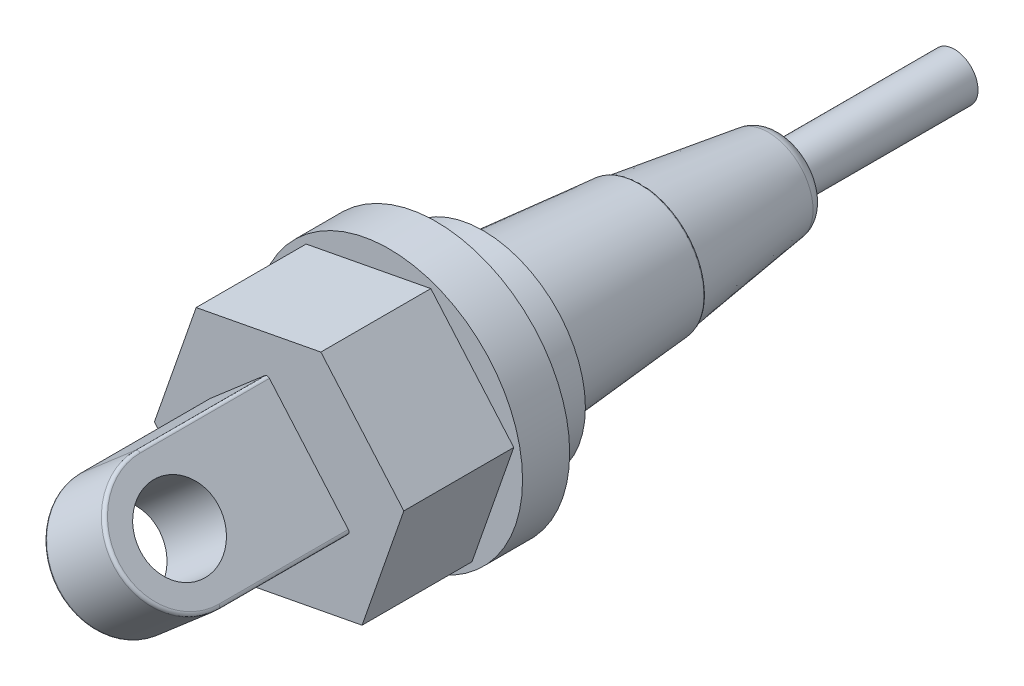
ISO-10303-21;
HEADER;
FILE_DESCRIPTION(('STEP AP214'),'2;1');
FILE_NAME('part.step','',(''),(''),'','','');
FILE_SCHEMA(('AUTOMOTIVE_DESIGN { 1 0 10303 214 1 1 1 1 }'));
ENDSEC;
DATA;
#1=APPLICATION_CONTEXT('core data for automotive mechanical design processes');
#2=APPLICATION_PROTOCOL_DEFINITION('international standard','automotive_design',2000,#1);
#3=PRODUCT_CONTEXT('',#1,'mechanical');
#4=PRODUCT('Part','Part','',(#3));
#5=PRODUCT_RELATED_PRODUCT_CATEGORY('part','',(#4));
#6=PRODUCT_DEFINITION_FORMATION('','',#4);
#7=PRODUCT_DEFINITION_CONTEXT('part definition',#1,'design');
#8=PRODUCT_DEFINITION('design','',#6,#7);
#9=PRODUCT_DEFINITION_SHAPE('','',#8);
#10=(LENGTH_UNIT() NAMED_UNIT(*) SI_UNIT(.MILLI.,.METRE.));
#11=(NAMED_UNIT(*) PLANE_ANGLE_UNIT() SI_UNIT($,.RADIAN.));
#12=(NAMED_UNIT(*) SI_UNIT($,.STERADIAN.) SOLID_ANGLE_UNIT());
#13=UNCERTAINTY_MEASURE_WITH_UNIT(LENGTH_MEASURE(1.E-05),#10,'distance_accuracy_value','');
#14=(GEOMETRIC_REPRESENTATION_CONTEXT(3) GLOBAL_UNCERTAINTY_ASSIGNED_CONTEXT((#13)) GLOBAL_UNIT_ASSIGNED_CONTEXT((#10,
#11,#12)) REPRESENTATION_CONTEXT('',''));
#15=CARTESIAN_POINT('',(0.,0.,0.));
#16=DIRECTION('',(0.,0.,1.));
#17=DIRECTION('',(1.,0.,0.));
#18=AXIS2_PLACEMENT_3D('',#15,#16,#17);
#19=CARTESIAN_POINT('',(0.,0.,10.));
#20=DIRECTION('',(0.,0.,1.));
#21=DIRECTION('',(1.,0.,0.));
#22=AXIS2_PLACEMENT_3D('',#19,#20,#21);
#23=PLANE('',#22);
#24=DIRECTION('',(0.982291780503088,0.187357567117191,0.));
#25=VECTOR('',#24,1.);
#26=CARTESIAN_POINT('',(-2.65838199745316,-1.35106512820731,10.));
#27=LINE('',#26,#25);
#28=CARTESIAN_POINT('',(-2.65838199745316,-1.35106512820731,10.));
#29=VERTEX_POINT('',#28);
#30=CARTESIAN_POINT('',(5.28138793709384,0.163328057130217,10.));
#31=VERTEX_POINT('',#30);
#32=EDGE_CURVE('E148',#29,#31,#27,.T.);
#33=ORIENTED_EDGE('',*,*,#32,.T.);
#34=DIRECTION('',(0.328889477536808,0.944368419402918,0.));
#35=VECTOR('',#34,1.);
#36=CARTESIAN_POINT('',(5.28138793709384,0.163328057130217,10.));
#37=LINE('',#36,#35);
#38=CARTESIAN_POINT('',(7.93976993454701,7.7965671133206,10.));
#39=VERTEX_POINT('',#38);
#40=EDGE_CURVE('E137',#31,#39,#37,.T.);
#41=ORIENTED_EDGE('',*,*,#40,.T.);
#42=DIRECTION('',(-0.65340230296628,0.757010852285727,0.));
#43=VECTOR('',#42,1.);
#44=CARTESIAN_POINT('',(7.93976993454701,7.7965671133206,10.));
#45=LINE('',#44,#43);
#46=CARTESIAN_POINT('',(2.65838199745316,13.9154129841735,10.));
#47=VERTEX_POINT('',#46);
#48=EDGE_CURVE('E147',#39,#47,#45,.T.);
#49=ORIENTED_EDGE('',*,*,#48,.T.);
#50=DIRECTION('',(-0.982291780503088,-0.187357567117191,0.));
#51=VECTOR('',#50,1.);
#52=CARTESIAN_POINT('',(2.65838199745316,13.9154129841735,10.));
#53=LINE('',#52,#51);
#54=CARTESIAN_POINT('',(-5.28138793709384,12.4010197988359,10.));
#55=VERTEX_POINT('',#54);
#56=EDGE_CURVE('E266',#47,#55,#53,.T.);
#57=ORIENTED_EDGE('',*,*,#56,.T.);
#58=DIRECTION('',(-0.328889477536808,-0.944368419402918,0.));
#59=VECTOR('',#58,1.);
#60=CARTESIAN_POINT('',(-5.28138793709384,12.4010197988359,10.));
#61=LINE('',#60,#59);
#62=CARTESIAN_POINT('',(-7.93976993454701,4.76778074264554,10.));
#63=VERTEX_POINT('',#62);
#64=EDGE_CURVE('E268',#55,#63,#61,.T.);
#65=ORIENTED_EDGE('',*,*,#64,.T.);
#66=DIRECTION('',(0.65340230296628,-0.757010852285727,0.));
#67=VECTOR('',#66,1.);
#68=CARTESIAN_POINT('',(-7.93976993454701,4.76778074264554,10.));
#69=LINE('',#68,#67);
#70=EDGE_CURVE('E153',#63,#29,#69,.T.);
#71=ORIENTED_EDGE('',*,*,#70,.T.);
#72=EDGE_LOOP('',(#33,#41,#49,#57,#65,#71));
#73=FACE_BOUND('',#72,.T.);
#74=DIRECTION('',(0.757010852285727,0.653402302966279,0.));
#75=VECTOR('',#74,1.);
#76=CARTESIAN_POINT('',(-4.53322109926123,7.70809110599379,10.));
#77=LINE('',#76,#75);
#78=CARTESIAN_POINT('',(-4.38181892880409,7.83877156658705,10.));
#79=VERTEX_POINT('',#78);
#80=CARTESIAN_POINT('',(-0.899569008289742,10.8444221602319,10.));
#81=VERTEX_POINT('',#80);
#82=EDGE_CURVE('E242',#79,#81,#77,.T.);
#83=ORIENTED_EDGE('',*,*,#82,.T.);
#84=CARTESIAN_POINT('',(-0.768888547696487,10.6930199897748,10.));
#85=DIRECTION('',(0.,0.,1.));
#86=DIRECTION('',(1.,0.,0.));
#87=AXIS2_PLACEMENT_3D('',#84,#85,#86);
#88=CIRCLE('',#87,0.2);
#89=CARTESIAN_POINT('',(-0.617486377239341,10.823700450368,10.));
#90=VERTEX_POINT('',#89);
#91=EDGE_CURVE('E215',#81,#90,#88,.F.);
#92=ORIENTED_EDGE('',*,*,#91,.T.);
#93=DIRECTION('',(0.653402302966279,-0.757010852285727,0.));
#94=VECTOR('',#93,1.);
#95=CARTESIAN_POINT('',(-0.748166837832597,10.9751026208252,10.));
#96=LINE('',#95,#94);
#97=CARTESIAN_POINT('',(4.40254063866798,5.00765892042949,10.));
#98=VERTEX_POINT('',#97);
#99=EDGE_CURVE('E236',#90,#98,#96,.T.);
#100=ORIENTED_EDGE('',*,*,#99,.T.);
#101=CARTESIAN_POINT('',(4.25113846821084,4.87697845983623,10.));
#102=DIRECTION('',(0.,0.,1.));
#103=DIRECTION('',(1.,0.,0.));
#104=AXIS2_PLACEMENT_3D('',#101,#102,#103);
#105=CIRCLE('',#104,0.2);
#106=CARTESIAN_POINT('',(4.38181892880409,4.72557628937908,10.));
#107=VERTEX_POINT('',#106);
#108=EDGE_CURVE('E213',#98,#107,#105,.F.);
#109=ORIENTED_EDGE('',*,*,#108,.T.);
#110=DIRECTION('',(0.757010852285727,0.653402302966279,0.));
#111=VECTOR('',#110,1.);
#112=CARTESIAN_POINT('',(0.748166837832606,1.58924523514094,10.));
#113=LINE('',#112,#111);
#114=CARTESIAN_POINT('',(0.899569008289751,1.7199256957342,10.));
#115=VERTEX_POINT('',#114);
#116=EDGE_CURVE('E253',#115,#107,#113,.T.);
#117=ORIENTED_EDGE('',*,*,#116,.F.);
#118=CARTESIAN_POINT('',(0.768888547696495,1.87132786619134,10.));
#119=DIRECTION('',(0.,0.,1.));
#120=DIRECTION('',(1.,0.,0.));
#121=AXIS2_PLACEMENT_3D('',#118,#119,#120);
#122=CIRCLE('',#121,0.2);
#123=CARTESIAN_POINT('',(0.617486377239347,1.74064740559809,10.));
#124=VERTEX_POINT('',#123);
#125=EDGE_CURVE('E43',#115,#124,#122,.F.);
#126=ORIENTED_EDGE('',*,*,#125,.T.);
#127=DIRECTION('',(0.653402302966279,-0.757010852285727,0.));
#128=VECTOR('',#127,1.);
#129=CARTESIAN_POINT('',(-4.53322109926123,7.70809110599379,10.));
#130=LINE('',#129,#128);
#131=CARTESIAN_POINT('',(-4.40254063866798,7.55668893553665,10.));
#132=VERTEX_POINT('',#131);
#133=EDGE_CURVE('E239',#132,#124,#130,.T.);
#134=ORIENTED_EDGE('',*,*,#133,.F.);
#135=CARTESIAN_POINT('',(-4.25113846821083,7.6873693961299,10.));
#136=DIRECTION('',(0.,0.,1.));
#137=DIRECTION('',(1.,0.,0.));
#138=AXIS2_PLACEMENT_3D('',#135,#136,#137);
#139=CIRCLE('',#138,0.2);
#140=EDGE_CURVE('E11',#132,#79,#139,.F.);
#141=ORIENTED_EDGE('',*,*,#140,.T.);
#142=EDGE_LOOP('',(#83,#92,#100,#109,#117,#126,#134,#141));
#143=FACE_BOUND('',#142,.T.);
#144=ADVANCED_FACE('F34',(#73,#143),#23,.T.);
#145=CARTESIAN_POINT('',(0.,6.28217392798307,3.));
#146=DIRECTION('',(0.,0.,1.));
#147=DIRECTION('',(1.,0.,0.));
#148=AXIS2_PLACEMENT_3D('',#145,#146,#147);
#149=PLANE('',#148);
#150=CARTESIAN_POINT('',(0.,6.28217392798307,3.));
#151=DIRECTION('',(0.,0.,1.));
#152=DIRECTION('',(1.,0.,0.));
#153=AXIS2_PLACEMENT_3D('',#150,#151,#152);
#154=CIRCLE('',#153,8.5);
#155=CARTESIAN_POINT('',(8.5,6.28217392798307,3.));
#156=VERTEX_POINT('',#155);
#157=EDGE_CURVE('E166',#156,#156,#154,.T.);
#158=ORIENTED_EDGE('',*,*,#157,.T.);
#159=EDGE_LOOP('',(#158));
#160=FACE_BOUND('',#159,.T.);
#161=DIRECTION('',(0.328889477536808,0.944368419402918,0.));
#162=VECTOR('',#161,1.);
#163=CARTESIAN_POINT('',(5.28138793709384,0.163328057130217,3.));
#164=LINE('',#163,#162);
#165=CARTESIAN_POINT('',(5.28138793709384,0.163328057130217,3.));
#166=VERTEX_POINT('',#165);
#167=CARTESIAN_POINT('',(7.93976993454701,7.7965671133206,3.));
#168=VERTEX_POINT('',#167);
#169=EDGE_CURVE('E273',#166,#168,#164,.T.);
#170=ORIENTED_EDGE('',*,*,#169,.F.);
#171=DIRECTION('',(0.982291780503088,0.187357567117191,0.));
#172=VECTOR('',#171,1.);
#173=CARTESIAN_POINT('',(-2.65838199745316,-1.35106512820731,3.));
#174=LINE('',#173,#172);
#175=CARTESIAN_POINT('',(-2.65838199745316,-1.35106512820731,3.));
#176=VERTEX_POINT('',#175);
#177=EDGE_CURVE('E161',#176,#166,#174,.T.);
#178=ORIENTED_EDGE('',*,*,#177,.F.);
#179=DIRECTION('',(0.65340230296628,-0.757010852285727,0.));
#180=VECTOR('',#179,1.);
#181=CARTESIAN_POINT('',(-7.93976993454701,4.76778074264554,3.));
#182=LINE('',#181,#180);
#183=CARTESIAN_POINT('',(-7.93976993454701,4.76778074264554,3.));
#184=VERTEX_POINT('',#183);
#185=EDGE_CURVE('E157',#184,#176,#182,.T.);
#186=ORIENTED_EDGE('',*,*,#185,.F.);
#187=DIRECTION('',(-0.328889477536808,-0.944368419402918,0.));
#188=VECTOR('',#187,1.);
#189=CARTESIAN_POINT('',(-5.28138793709384,12.4010197988359,3.));
#190=LINE('',#189,#188);
#191=CARTESIAN_POINT('',(-5.28138793709384,12.4010197988359,3.));
#192=VERTEX_POINT('',#191);
#193=EDGE_CURVE('E279',#192,#184,#190,.T.);
#194=ORIENTED_EDGE('',*,*,#193,.F.);
#195=DIRECTION('',(-0.982291780503088,-0.187357567117191,0.));
#196=VECTOR('',#195,1.);
#197=CARTESIAN_POINT('',(2.65838199745316,13.9154129841735,3.));
#198=LINE('',#197,#196);
#199=CARTESIAN_POINT('',(2.65838199745316,13.9154129841735,3.));
#200=VERTEX_POINT('',#199);
#201=EDGE_CURVE('E277',#200,#192,#198,.T.);
#202=ORIENTED_EDGE('',*,*,#201,.F.);
#203=DIRECTION('',(-0.65340230296628,0.757010852285727,0.));
#204=VECTOR('',#203,1.);
#205=CARTESIAN_POINT('',(7.93976993454701,7.7965671133206,3.));
#206=LINE('',#205,#204);
#207=EDGE_CURVE('E275',#168,#200,#206,.T.);
#208=ORIENTED_EDGE('',*,*,#207,.F.);
#209=EDGE_LOOP('',(#170,#178,#186,#194,#202,#208));
#210=FACE_BOUND('',#209,.T.);
#211=ADVANCED_FACE('F299',(#160,#210),#149,.T.);
#212=CARTESIAN_POINT('',(0.,6.28217392798307,3.));
#213=DIRECTION('',(0.,0.,-1.));
#214=DIRECTION('',(-1.,0.,0.));
#215=AXIS2_PLACEMENT_3D('',#212,#213,#214);
#216=CYLINDRICAL_SURFACE('',#215,8.5);
#217=ORIENTED_EDGE('',*,*,#157,.F.);
#218=EDGE_LOOP('',(#217));
#219=FACE_BOUND('',#218,.T.);
#220=CARTESIAN_POINT('',(0.,6.28217392798307,0.));
#221=DIRECTION('',(0.,0.,1.));
#222=DIRECTION('',(1.,0.,0.));
#223=AXIS2_PLACEMENT_3D('',#220,#221,#222);
#224=CIRCLE('',#223,8.5);
#225=CARTESIAN_POINT('',(8.5,6.28217392798307,0.));
#226=VERTEX_POINT('',#225);
#227=EDGE_CURVE('E163',#226,#226,#224,.T.);
#228=ORIENTED_EDGE('',*,*,#227,.T.);
#229=EDGE_LOOP('',(#228));
#230=FACE_BOUND('',#229,.T.);
#231=ADVANCED_FACE('F319',(#219,#230),#216,.T.);
#232=CARTESIAN_POINT('',(0.,6.28217392798307,0.));
#233=DIRECTION('',(0.,0.,1.));
#234=DIRECTION('',(1.,0.,0.));
#235=AXIS2_PLACEMENT_3D('',#232,#233,#234);
#236=PLANE('',#235);
#237=CARTESIAN_POINT('',(0.,6.28217392798307,0.));
#238=DIRECTION('',(0.,0.,1.));
#239=DIRECTION('',(1.,0.,0.));
#240=AXIS2_PLACEMENT_3D('',#237,#238,#239);
#241=CIRCLE('',#240,6.5);
#242=CARTESIAN_POINT('',(6.5,6.28217392798307,0.));
#243=VERTEX_POINT('',#242);
#244=EDGE_CURVE('E173',#243,#243,#241,.F.);
#245=ORIENTED_EDGE('',*,*,#244,.F.);
#246=EDGE_LOOP('',(#245));
#247=FACE_BOUND('',#246,.T.);
#248=ORIENTED_EDGE('',*,*,#227,.F.);
#249=EDGE_LOOP('',(#248));
#250=FACE_BOUND('',#249,.T.);
#251=ADVANCED_FACE('F580',(#247,#250),#236,.F.);
#252=CARTESIAN_POINT('',(-2.65838199745316,-1.35106512820731,10.));
#253=DIRECTION('',(-0.187357567117191,0.982291780503088,0.));
#254=DIRECTION('',(-0.982291780503088,-0.187357567117191,0.));
#255=AXIS2_PLACEMENT_3D('',#252,#253,#254);
#256=PLANE('',#255);
#257=ORIENTED_EDGE('',*,*,#177,.T.);
#258=DIRECTION('',(0.,0.,-1.));
#259=VECTOR('',#258,1.);
#260=CARTESIAN_POINT('',(5.28138793709384,0.163328057130217,10.));
#261=LINE('',#260,#259);
#262=EDGE_CURVE('E141',#31,#166,#261,.T.);
#263=ORIENTED_EDGE('',*,*,#262,.F.);
#264=ORIENTED_EDGE('',*,*,#32,.F.);
#265=DIRECTION('',(0.,0.,-1.));
#266=VECTOR('',#265,1.);
#267=CARTESIAN_POINT('',(-2.65838199745316,-1.35106512820731,10.));
#268=LINE('',#267,#266);
#269=EDGE_CURVE('E271',#29,#176,#268,.T.);
#270=ORIENTED_EDGE('',*,*,#269,.T.);
#271=EDGE_LOOP('',(#257,#263,#264,#270));
#272=FACE_BOUND('',#271,.T.);
#273=ADVANCED_FACE('F159',(#272),#256,.F.);
#274=CARTESIAN_POINT('',(5.28138793709384,0.163328057130217,10.));
#275=DIRECTION('',(-0.944368419402918,0.328889477536808,0.));
#276=DIRECTION('',(-0.328889477536808,-0.944368419402918,0.));
#277=AXIS2_PLACEMENT_3D('',#274,#275,#276);
#278=PLANE('',#277);
#279=ORIENTED_EDGE('',*,*,#169,.T.);
#280=DIRECTION('',(0.,0.,-1.));
#281=VECTOR('',#280,1.);
#282=CARTESIAN_POINT('',(7.93976993454701,7.7965671133206,10.));
#283=LINE('',#282,#281);
#284=EDGE_CURVE('E144',#39,#168,#283,.T.);
#285=ORIENTED_EDGE('',*,*,#284,.F.);
#286=ORIENTED_EDGE('',*,*,#40,.F.);
#287=ORIENTED_EDGE('',*,*,#262,.T.);
#288=EDGE_LOOP('',(#279,#285,#286,#287));
#289=FACE_BOUND('',#288,.T.);
#290=ADVANCED_FACE('F139',(#289),#278,.F.);
#291=CARTESIAN_POINT('',(7.93976993454701,7.7965671133206,10.));
#292=DIRECTION('',(-0.757010852285727,-0.65340230296628,0.));
#293=DIRECTION('',(0.65340230296628,-0.757010852285727,0.));
#294=AXIS2_PLACEMENT_3D('',#291,#292,#293);
#295=PLANE('',#294);
#296=ORIENTED_EDGE('',*,*,#207,.T.);
#297=DIRECTION('',(0.,0.,-1.));
#298=VECTOR('',#297,1.);
#299=CARTESIAN_POINT('',(2.65838199745316,13.9154129841735,10.));
#300=LINE('',#299,#298);
#301=EDGE_CURVE('E168',#47,#200,#300,.T.);
#302=ORIENTED_EDGE('',*,*,#301,.F.);
#303=ORIENTED_EDGE('',*,*,#48,.F.);
#304=ORIENTED_EDGE('',*,*,#284,.T.);
#305=EDGE_LOOP('',(#296,#302,#303,#304));
#306=FACE_BOUND('',#305,.T.);
#307=ADVANCED_FACE('F305',(#306),#295,.F.);
#308=CARTESIAN_POINT('',(2.65838199745316,13.9154129841735,10.));
#309=DIRECTION('',(0.187357567117191,-0.982291780503088,0.));
#310=DIRECTION('',(0.982291780503088,0.187357567117191,0.));
#311=AXIS2_PLACEMENT_3D('',#308,#309,#310);
#312=PLANE('',#311);
#313=ORIENTED_EDGE('',*,*,#201,.T.);
#314=DIRECTION('',(0.,0.,-1.));
#315=VECTOR('',#314,1.);
#316=CARTESIAN_POINT('',(-5.28138793709384,12.4010197988359,10.));
#317=LINE('',#316,#315);
#318=EDGE_CURVE('E286',#55,#192,#317,.T.);
#319=ORIENTED_EDGE('',*,*,#318,.F.);
#320=ORIENTED_EDGE('',*,*,#56,.F.);
#321=ORIENTED_EDGE('',*,*,#301,.T.);
#322=EDGE_LOOP('',(#313,#319,#320,#321));
#323=FACE_BOUND('',#322,.T.);
#324=ADVANCED_FACE('F293',(#323),#312,.F.);
#325=CARTESIAN_POINT('',(-5.28138793709384,12.4010197988359,10.));
#326=DIRECTION('',(0.944368419402918,-0.328889477536808,0.));
#327=DIRECTION('',(0.328889477536808,0.944368419402918,0.));
#328=AXIS2_PLACEMENT_3D('',#325,#326,#327);
#329=PLANE('',#328);
#330=ORIENTED_EDGE('',*,*,#193,.T.);
#331=DIRECTION('',(0.,0.,-1.));
#332=VECTOR('',#331,1.);
#333=CARTESIAN_POINT('',(-7.93976993454701,4.76778074264554,10.));
#334=LINE('',#333,#332);
#335=EDGE_CURVE('E284',#63,#184,#334,.T.);
#336=ORIENTED_EDGE('',*,*,#335,.F.);
#337=ORIENTED_EDGE('',*,*,#64,.F.);
#338=ORIENTED_EDGE('',*,*,#318,.T.);
#339=EDGE_LOOP('',(#330,#336,#337,#338));
#340=FACE_BOUND('',#339,.T.);
#341=ADVANCED_FACE('F303',(#340),#329,.F.);
#342=CARTESIAN_POINT('',(-7.93976993454701,4.76778074264554,10.));
#343=DIRECTION('',(0.757010852285726,0.65340230296628,0.));
#344=DIRECTION('',(-0.65340230296628,0.757010852285727,0.));
#345=AXIS2_PLACEMENT_3D('',#342,#343,#344);
#346=PLANE('',#345);
#347=ORIENTED_EDGE('',*,*,#185,.T.);
#348=ORIENTED_EDGE('',*,*,#269,.F.);
#349=ORIENTED_EDGE('',*,*,#70,.F.);
#350=ORIENTED_EDGE('',*,*,#335,.T.);
#351=EDGE_LOOP('',(#347,#348,#349,#350));
#352=FACE_BOUND('',#351,.T.);
#353=ADVANCED_FACE('F326',(#352),#346,.F.);
#354=CARTESIAN_POINT('',(0.,6.28217392798307,-3.));
#355=DIRECTION('',(0.,0.,1.));
#356=DIRECTION('',(1.,0.,0.));
#357=AXIS2_PLACEMENT_3D('',#354,#355,#356);
#358=CYLINDRICAL_SURFACE('',#357,6.5);
#359=CARTESIAN_POINT('',(0.,6.28217392798307,-3.));
#360=DIRECTION('',(0.,0.,-1.));
#361=DIRECTION('',(-1.,0.,0.));
#362=AXIS2_PLACEMENT_3D('',#359,#360,#361);
#363=CIRCLE('',#362,6.5);
#364=CARTESIAN_POINT('',(-6.5,6.28217392798307,-3.));
#365=VERTEX_POINT('',#364);
#366=EDGE_CURVE('E262',#365,#365,#363,.T.);
#367=ORIENTED_EDGE('',*,*,#366,.F.);
#368=EDGE_LOOP('',(#367));
#369=FACE_BOUND('',#368,.T.);
#370=ORIENTED_EDGE('',*,*,#244,.T.);
#371=EDGE_LOOP('',(#370));
#372=FACE_BOUND('',#371,.T.);
#373=ADVANCED_FACE('F324',(#369,#372),#358,.T.);
#374=CARTESIAN_POINT('',(0.,6.28217392798307,-3.));
#375=DIRECTION('',(0.,0.,-1.));
#376=DIRECTION('',(-1.,0.,0.));
#377=AXIS2_PLACEMENT_3D('',#374,#375,#376);
#378=PLANE('',#377);
#379=CARTESIAN_POINT('',(0.,6.28217392798307,-3.));
#380=DIRECTION('',(0.,0.,-1.));
#381=DIRECTION('',(-1.,0.,0.));
#382=AXIS2_PLACEMENT_3D('',#379,#380,#381);
#383=CIRCLE('',#382,5.);
#384=CARTESIAN_POINT('',(-5.,6.28217392798307,-3.));
#385=VERTEX_POINT('',#384);
#386=EDGE_CURVE('E259',#385,#385,#383,.T.);
#387=ORIENTED_EDGE('',*,*,#386,.F.);
#388=EDGE_LOOP('',(#387));
#389=FACE_BOUND('',#388,.T.);
#390=ORIENTED_EDGE('',*,*,#366,.T.);
#391=EDGE_LOOP('',(#390));
#392=FACE_BOUND('',#391,.T.);
#393=ADVANCED_FACE('F346',(#389,#392),#378,.T.);
#394=CARTESIAN_POINT('',(0.,6.28217392798307,-3.));
#395=DIRECTION('',(0.,0.,1.));
#396=DIRECTION('',(-1.,0.,0.));
#397=AXIS2_PLACEMENT_3D('',#394,#395,#396);
#398=CONICAL_SURFACE('',#397,5.,0.0872664625997165);
#399=CARTESIAN_POINT('',(0.,6.28217392798307,-12.9087155742748));
#400=DIRECTION('',(0.,0.,1.));
#401=DIRECTION('',(1.,0.,0.));
#402=AXIS2_PLACEMENT_3D('',#399,#400,#401);
#403=CIRCLE('',#402,4.13309971714819);
#404=CARTESIAN_POINT('',(4.13309971714819,6.28217392798307,-12.9087155742748));
#405=VERTEX_POINT('',#404);
#406=EDGE_CURVE('E180',#405,#405,#403,.T.);
#407=ORIENTED_EDGE('',*,*,#406,.T.);
#408=EDGE_LOOP('',(#407));
#409=FACE_BOUND('',#408,.T.);
#410=ORIENTED_EDGE('',*,*,#386,.T.);
#411=EDGE_LOOP('',(#410));
#412=FACE_BOUND('',#411,.T.);
#413=ADVANCED_FACE('F353',(#409,#412),#398,.T.);
#414=CARTESIAN_POINT('',(0.,6.28217392798307,-13.));
#415=DIRECTION('',(0.,0.,-1.));
#416=DIRECTION('',(-1.,0.,0.));
#417=AXIS2_PLACEMENT_3D('',#414,#415,#416);
#418=PLANE('',#417);
#419=CARTESIAN_POINT('',(0.,6.28217392798307,-13.));
#420=DIRECTION('',(0.,0.,-1.));
#421=DIRECTION('',(-1.,0.,0.));
#422=AXIS2_PLACEMENT_3D('',#419,#420,#421);
#423=CIRCLE('',#422,4.03348024733902);
#424=CARTESIAN_POINT('',(-4.03348024733902,6.28217392798307,-13.));
#425=VERTEX_POINT('',#424);
#426=EDGE_CURVE('E177',#425,#425,#423,.T.);
#427=ORIENTED_EDGE('',*,*,#426,.T.);
#428=EDGE_LOOP('',(#427));
#429=FACE_BOUND('',#428,.T.);
#430=CARTESIAN_POINT('',(0.,6.28217392798307,-13.));
#431=DIRECTION('',(0.,0.,-1.));
#432=DIRECTION('',(-1.,0.,0.));
#433=AXIS2_PLACEMENT_3D('',#430,#431,#432);
#434=CIRCLE('',#433,4.);
#435=CARTESIAN_POINT('',(-4.,6.28217392798307,-13.));
#436=VERTEX_POINT('',#435);
#437=EDGE_CURVE('E256',#436,#436,#434,.T.);
#438=ORIENTED_EDGE('',*,*,#437,.F.);
#439=EDGE_LOOP('',(#438));
#440=FACE_BOUND('',#439,.T.);
#441=ADVANCED_FACE('F360',(#429,#440),#418,.T.);
#442=CARTESIAN_POINT('',(0.,6.28217392798307,-13.));
#443=DIRECTION('',(0.,0.,1.));
#444=DIRECTION('',(-1.,0.,0.));
#445=AXIS2_PLACEMENT_3D('',#442,#443,#444);
#446=CONICAL_SURFACE('',#445,4.,0.139626340159546);
#447=CARTESIAN_POINT('',(0.,6.28217392798307,-21.1391731009601));
#448=DIRECTION('',(0.,0.,1.));
#449=DIRECTION('',(1.,0.,0.));
#450=AXIS2_PLACEMENT_3D('',#447,#448,#449);
#451=CIRCLE('',#450,2.85611381860382);
#452=CARTESIAN_POINT('',(2.85611381860382,6.28217392798307,-21.1391731009601));
#453=VERTEX_POINT('',#452);
#454=EDGE_CURVE('E186',#453,#453,#451,.T.);
#455=ORIENTED_EDGE('',*,*,#454,.T.);
#456=EDGE_LOOP('',(#455));
#457=FACE_BOUND('',#456,.T.);
#458=ORIENTED_EDGE('',*,*,#437,.T.);
#459=EDGE_LOOP('',(#458));
#460=FACE_BOUND('',#459,.T.);
#461=ADVANCED_FACE('F368',(#457,#460),#446,.T.);
#462=CARTESIAN_POINT('',(0.,6.28217392798307,-22.));
#463=DIRECTION('',(0.,0.,-1.));
#464=DIRECTION('',(-1.,0.,0.));
#465=AXIS2_PLACEMENT_3D('',#462,#463,#464);
#466=PLANE('',#465);
#467=CARTESIAN_POINT('',(0.,6.28217392798307,-22.));
#468=DIRECTION('',(0.,0.,-1.));
#469=DIRECTION('',(-1.,0.,0.));
#470=AXIS2_PLACEMENT_3D('',#467,#468,#469);
#471=CIRCLE('',#470,1.5);
#472=CARTESIAN_POINT('',(-1.5,6.28217392798307,-22.));
#473=VERTEX_POINT('',#472);
#474=EDGE_CURVE('E226',#473,#473,#471,.T.);
#475=ORIENTED_EDGE('',*,*,#474,.F.);
#476=EDGE_LOOP('',(#475));
#477=FACE_BOUND('',#476,.T.);
#478=CARTESIAN_POINT('',(0.,6.28217392798307,-22.));
#479=DIRECTION('',(0.,0.,-1.));
#480=DIRECTION('',(-1.,0.,0.));
#481=AXIS2_PLACEMENT_3D('',#478,#479,#480);
#482=CIRCLE('',#481,1.86584574986225);
#483=CARTESIAN_POINT('',(-1.86584574986225,6.28217392798307,-22.));
#484=VERTEX_POINT('',#483);
#485=EDGE_CURVE('E183',#484,#484,#482,.T.);
#486=ORIENTED_EDGE('',*,*,#485,.T.);
#487=EDGE_LOOP('',(#486));
#488=FACE_BOUND('',#487,.T.);
#489=ADVANCED_FACE('F377',(#477,#488),#466,.T.);
#490=CARTESIAN_POINT('',(0.,6.28217392798307,-12.9));
#491=DIRECTION('',(0.,0.,-1.));
#492=DIRECTION('',(-1.,0.,0.));
#493=AXIS2_PLACEMENT_3D('',#490,#491,#492);
#494=TOROIDAL_SURFACE('',#493,4.03348024733902,0.1);
#495=ORIENTED_EDGE('',*,*,#406,.F.);
#496=EDGE_LOOP('',(#495));
#497=FACE_BOUND('',#496,.T.);
#498=ORIENTED_EDGE('',*,*,#426,.F.);
#499=EDGE_LOOP('',(#498));
#500=FACE_BOUND('',#499,.T.);
#501=ADVANCED_FACE('F386',(#497,#500),#494,.T.);
#502=CARTESIAN_POINT('',(0.,6.28217392798307,-21.));
#503=DIRECTION('',(0.,0.,-1.));
#504=DIRECTION('',(-1.,0.,0.));
#505=AXIS2_PLACEMENT_3D('',#502,#503,#504);
#506=TOROIDAL_SURFACE('',#505,1.86584574986225,1.);
#507=ORIENTED_EDGE('',*,*,#454,.F.);
#508=EDGE_LOOP('',(#507));
#509=FACE_BOUND('',#508,.T.);
#510=ORIENTED_EDGE('',*,*,#485,.F.);
#511=EDGE_LOOP('',(#510));
#512=FACE_BOUND('',#511,.T.);
#513=ADVANCED_FACE('F395',(#509,#512),#506,.T.);
#514=CARTESIAN_POINT('',(-1.89252713071431,4.64866817056737,18.231507410073));
#515=DIRECTION('',(0.757010852285727,0.653402302966279,0.));
#516=DIRECTION('',(-0.653402302966279,0.757010852285727,0.));
#517=AXIS2_PLACEMENT_3D('',#514,#515,#516);
#518=PLANE('',#517);
#519=ORIENTED_EDGE('',*,*,#133,.T.);
#520=DIRECTION('',(0.,0.,1.));
#521=VECTOR('',#520,1.);
#522=CARTESIAN_POINT('',(0.617486377239348,1.74064740559809,18.231507410073));
#523=LINE('',#522,#521);
#524=CARTESIAN_POINT('',(0.617486377239348,1.74064740559809,18.231507410073));
#525=VERTEX_POINT('',#524);
#526=EDGE_CURVE('E207',#124,#525,#523,.T.);
#527=ORIENTED_EDGE('',*,*,#526,.T.);
#528=CARTESIAN_POINT('',(-1.89252713071431,4.64866817056737,18.231507410073));
#529=DIRECTION('',(0.757010852285727,0.653402302966279,0.));
#530=DIRECTION('',(-0.653402302966279,0.757010852285727,0.));
#531=AXIS2_PLACEMENT_3D('',#528,#529,#530);
#532=CIRCLE('',#531,3.84145188432738);
#533=CARTESIAN_POINT('',(-4.40254063866798,7.55668893553665,18.231507410073));
#534=VERTEX_POINT('',#533);
#535=EDGE_CURVE('E51',#525,#534,#532,.F.);
#536=ORIENTED_EDGE('',*,*,#535,.T.);
#537=DIRECTION('',(0.,0.,-1.));
#538=VECTOR('',#537,1.);
#539=CARTESIAN_POINT('',(-4.40254063866798,7.55668893553665,18.231507410073));
#540=LINE('',#539,#538);
#541=EDGE_CURVE('E205',#534,#132,#540,.T.);
#542=ORIENTED_EDGE('',*,*,#541,.T.);
#543=EDGE_LOOP('',(#519,#527,#536,#542));
#544=FACE_BOUND('',#543,.T.);
#545=CARTESIAN_POINT('',(-1.89252713071431,4.64866817056737,18.231507410073));
#546=DIRECTION('',(-0.757010852285727,-0.653402302966279,0.));
#547=DIRECTION('',(0.653402302966279,-0.757010852285727,0.));
#548=AXIS2_PLACEMENT_3D('',#545,#546,#547);
#549=CIRCLE('',#548,2.5);
#550=CARTESIAN_POINT('',(-0.259021373298616,2.75614103985305,18.231507410073));
#551=VERTEX_POINT('',#550);
#552=EDGE_CURVE('E233',#551,#551,#549,.T.);
#553=ORIENTED_EDGE('',*,*,#552,.F.);
#554=EDGE_LOOP('',(#553));
#555=FACE_BOUND('',#554,.T.);
#556=ADVANCED_FACE('F402',(#544,#555),#518,.F.);
#557=CARTESIAN_POINT('',(1.89252713071432,7.91567968539876,18.231507410073));
#558=DIRECTION('',(0.757010852285727,0.653402302966279,0.));
#559=DIRECTION('',(-0.653402302966279,0.757010852285727,0.));
#560=AXIS2_PLACEMENT_3D('',#557,#558,#559);
#561=PLANE('',#560);
#562=CARTESIAN_POINT('',(1.89252713071432,7.91567968539876,18.231507410073));
#563=DIRECTION('',(0.757010852285727,0.653402302966279,0.));
#564=DIRECTION('',(-0.653402302966279,0.757010852285727,0.));
#565=AXIS2_PLACEMENT_3D('',#562,#563,#564);
#566=CIRCLE('',#565,3.84145188432738);
#567=CARTESIAN_POINT('',(-0.617486377239341,10.823700450368,18.231507410073));
#568=VERTEX_POINT('',#567);
#569=CARTESIAN_POINT('',(4.40254063866798,5.00765892042948,18.231507410073));
#570=VERTEX_POINT('',#569);
#571=EDGE_CURVE('E194',#568,#570,#566,.T.);
#572=ORIENTED_EDGE('',*,*,#571,.T.);
#573=DIRECTION('',(0.,0.,1.));
#574=VECTOR('',#573,1.);
#575=CARTESIAN_POINT('',(4.40254063866798,5.00765892042948,10.));
#576=LINE('',#575,#574);
#577=EDGE_CURVE('E198',#570,#98,#576,.F.);
#578=ORIENTED_EDGE('',*,*,#577,.T.);
#579=ORIENTED_EDGE('',*,*,#99,.F.);
#580=DIRECTION('',(0.,0.,-1.));
#581=VECTOR('',#580,1.);
#582=CARTESIAN_POINT('',(-0.617486377239343,10.823700450368,18.231507410073));
#583=LINE('',#582,#581);
#584=EDGE_CURVE('E196',#90,#568,#583,.F.);
#585=ORIENTED_EDGE('',*,*,#584,.T.);
#586=EDGE_LOOP('',(#572,#578,#579,#585));
#587=FACE_BOUND('',#586,.T.);
#588=CARTESIAN_POINT('',(1.89252713071432,7.91567968539876,18.231507410073));
#589=DIRECTION('',(-0.757010852285727,-0.653402302966279,0.));
#590=DIRECTION('',(0.653402302966279,-0.757010852285727,0.));
#591=AXIS2_PLACEMENT_3D('',#588,#589,#590);
#592=CIRCLE('',#591,2.5);
#593=CARTESIAN_POINT('',(3.52603288813002,6.02315255468445,18.231507410073));
#594=VERTEX_POINT('',#593);
#595=EDGE_CURVE('E222',#594,#594,#592,.T.);
#596=ORIENTED_EDGE('',*,*,#595,.T.);
#597=EDGE_LOOP('',(#596));
#598=FACE_BOUND('',#597,.T.);
#599=ADVANCED_FACE('F411',(#587,#598),#561,.T.);
#600=CARTESIAN_POINT('',(0.748166837832604,1.58924523514094,18.231507410073));
#601=DIRECTION('',(-0.653402302966279,0.757010852285727,0.));
#602=DIRECTION('',(-0.757010852285727,-0.653402302966279,0.));
#603=AXIS2_PLACEMENT_3D('',#600,#601,#602);
#604=PLANE('',#603);
#605=ORIENTED_EDGE('',*,*,#116,.T.);
#606=DIRECTION('',(0.,0.,1.));
#607=VECTOR('',#606,1.);
#608=CARTESIAN_POINT('',(4.38181892880409,4.72557628937908,18.231507410073));
#609=LINE('',#608,#607);
#610=CARTESIAN_POINT('',(4.38181892880409,4.72557628937908,18.231507410073));
#611=VERTEX_POINT('',#610);
#612=EDGE_CURVE('E191',#107,#611,#609,.T.);
#613=ORIENTED_EDGE('',*,*,#612,.T.);
#614=DIRECTION('',(0.757010852285727,0.653402302966279,0.));
#615=VECTOR('',#614,1.);
#616=CARTESIAN_POINT('',(0.748166837832604,1.58924523514094,18.231507410073));
#617=LINE('',#616,#615);
#618=CARTESIAN_POINT('',(0.899569008289749,1.7199256957342,18.231507410073));
#619=VERTEX_POINT('',#618);
#620=EDGE_CURVE('E250',#619,#611,#617,.T.);
#621=ORIENTED_EDGE('',*,*,#620,.F.);
#622=DIRECTION('',(0.,0.,1.));
#623=VECTOR('',#622,1.);
#624=CARTESIAN_POINT('',(0.899569008289749,1.7199256957342,18.231507410073));
#625=LINE('',#624,#623);
#626=EDGE_CURVE('E189',#619,#115,#625,.F.);
#627=ORIENTED_EDGE('',*,*,#626,.T.);
#628=EDGE_LOOP('',(#605,#613,#621,#627));
#629=FACE_BOUND('',#628,.T.);
#630=ADVANCED_FACE('F418',(#629),#604,.F.);
#631=CARTESIAN_POINT('',(-1.89252713071431,4.64866817056737,18.231507410073));
#632=DIRECTION('',(0.757010852285727,0.653402302966279,0.));
#633=DIRECTION('',(-0.653402302966279,0.757010852285727,0.));
#634=AXIS2_PLACEMENT_3D('',#631,#632,#633);
#635=CYLINDRICAL_SURFACE('',#634,4.04145188432738);
#636=ORIENTED_EDGE('',*,*,#620,.T.);
#637=CARTESIAN_POINT('',(1.74112496025718,7.78499922480551,18.231507410073));
#638=DIRECTION('',(0.757010852285727,0.653402302966279,0.));
#639=DIRECTION('',(-0.653402302966279,0.757010852285727,0.));
#640=AXIS2_PLACEMENT_3D('',#637,#638,#639);
#641=CIRCLE('',#640,4.04145188432738);
#642=CARTESIAN_POINT('',(-0.899569008289742,10.8444221602319,18.231507410073));
#643=VERTEX_POINT('',#642);
#644=EDGE_CURVE('E211',#611,#643,#641,.F.);
#645=ORIENTED_EDGE('',*,*,#644,.T.);
#646=DIRECTION('',(0.757010852285727,0.653402302966279,0.));
#647=VECTOR('',#646,1.);
#648=CARTESIAN_POINT('',(-4.53322109926123,7.70809110599379,18.231507410073));
#649=LINE('',#648,#647);
#650=CARTESIAN_POINT('',(-4.38181892880409,7.83877156658705,18.231507410073));
#651=VERTEX_POINT('',#650);
#652=EDGE_CURVE('E247',#651,#643,#649,.T.);
#653=ORIENTED_EDGE('',*,*,#652,.F.);
#654=CARTESIAN_POINT('',(-1.74112496025717,4.77934863116062,18.231507410073));
#655=DIRECTION('',(0.757010852285727,0.653402302966279,0.));
#656=DIRECTION('',(-0.653402302966279,0.757010852285727,0.));
#657=AXIS2_PLACEMENT_3D('',#654,#655,#656);
#658=CIRCLE('',#657,4.04145188432738);
#659=EDGE_CURVE('E209',#651,#619,#658,.T.);
#660=ORIENTED_EDGE('',*,*,#659,.T.);
#661=EDGE_LOOP('',(#636,#645,#653,#660));
#662=FACE_BOUND('',#661,.T.);
#663=ADVANCED_FACE('F426',(#662),#635,.T.);
#664=CARTESIAN_POINT('',(-4.53322109926123,7.70809110599379,10.));
#665=DIRECTION('',(0.653402302966279,-0.757010852285727,0.));
#666=DIRECTION('',(0.757010852285727,0.653402302966279,0.));
#667=AXIS2_PLACEMENT_3D('',#664,#665,#666);
#668=PLANE('',#667);
#669=ORIENTED_EDGE('',*,*,#652,.T.);
#670=DIRECTION('',(0.,0.,-1.));
#671=VECTOR('',#670,1.);
#672=CARTESIAN_POINT('',(-0.899569008289742,10.8444221602319,10.));
#673=LINE('',#672,#671);
#674=EDGE_CURVE('E202',#643,#81,#673,.T.);
#675=ORIENTED_EDGE('',*,*,#674,.T.);
#676=ORIENTED_EDGE('',*,*,#82,.F.);
#677=DIRECTION('',(0.,0.,-1.));
#678=VECTOR('',#677,1.);
#679=CARTESIAN_POINT('',(-4.38181892880409,7.83877156658705,10.));
#680=LINE('',#679,#678);
#681=EDGE_CURVE('E200',#79,#651,#680,.F.);
#682=ORIENTED_EDGE('',*,*,#681,.T.);
#683=EDGE_LOOP('',(#669,#675,#676,#682));
#684=FACE_BOUND('',#683,.T.);
#685=ADVANCED_FACE('F434',(#684),#668,.F.);
#686=CARTESIAN_POINT('',(-1.89252713071431,4.64866817056737,18.231507410073));
#687=DIRECTION('',(0.757010852285727,0.653402302966279,0.));
#688=DIRECTION('',(-0.653402302966279,0.757010852285727,0.));
#689=AXIS2_PLACEMENT_3D('',#686,#687,#688);
#690=CYLINDRICAL_SURFACE('',#689,2.5);
#691=ORIENTED_EDGE('',*,*,#552,.T.);
#692=EDGE_LOOP('',(#691));
#693=FACE_BOUND('',#692,.T.);
#694=ORIENTED_EDGE('',*,*,#595,.F.);
#695=EDGE_LOOP('',(#694));
#696=FACE_BOUND('',#695,.T.);
#697=ADVANCED_FACE('F442',(#693,#696),#690,.F.);
#698=CARTESIAN_POINT('',(-0.768888547696487,10.6930199897748,10.));
#699=DIRECTION('',(0.,0.,1.));
#700=DIRECTION('',(1.,0.,0.));
#701=AXIS2_PLACEMENT_3D('',#698,#699,#700);
#702=CYLINDRICAL_SURFACE('',#701,0.2);
#703=ORIENTED_EDGE('',*,*,#91,.F.);
#704=ORIENTED_EDGE('',*,*,#674,.F.);
#705=CARTESIAN_POINT('',(-0.768888547696488,10.6930199897748,18.231507410073));
#706=DIRECTION('',(0.,0.,1.));
#707=DIRECTION('',(1.,0.,0.));
#708=AXIS2_PLACEMENT_3D('',#705,#706,#707);
#709=CIRCLE('',#708,0.2);
#710=EDGE_CURVE('E220',#568,#643,#709,.T.);
#711=ORIENTED_EDGE('',*,*,#710,.F.);
#712=ORIENTED_EDGE('',*,*,#584,.F.);
#713=EDGE_LOOP('',(#703,#704,#711,#712));
#714=FACE_BOUND('',#713,.T.);
#715=ADVANCED_FACE('F450',(#714),#702,.T.);
#716=CARTESIAN_POINT('',(1.74112496025718,7.78499922480551,18.231507410073));
#717=DIRECTION('',(0.757010852285727,0.653402302966279,0.));
#718=DIRECTION('',(-0.653402302966279,0.757010852285727,0.));
#719=AXIS2_PLACEMENT_3D('',#716,#717,#718);
#720=TOROIDAL_SURFACE('',#719,3.84145188432738,0.2);
#721=ORIENTED_EDGE('',*,*,#710,.T.);
#722=ORIENTED_EDGE('',*,*,#644,.F.);
#723=CARTESIAN_POINT('',(4.25113846821084,4.87697845983623,18.231507410073));
#724=DIRECTION('',(0.,0.,-1.));
#725=DIRECTION('',(-1.,0.,0.));
#726=AXIS2_PLACEMENT_3D('',#723,#724,#725);
#727=CIRCLE('',#726,0.2);
#728=EDGE_CURVE('E218',#570,#611,#727,.T.);
#729=ORIENTED_EDGE('',*,*,#728,.F.);
#730=ORIENTED_EDGE('',*,*,#571,.F.);
#731=EDGE_LOOP('',(#721,#722,#729,#730));
#732=FACE_BOUND('',#731,.T.);
#733=ADVANCED_FACE('F457',(#732),#720,.T.);
#734=CARTESIAN_POINT('',(4.25113846821084,4.87697845983623,18.231507410073));
#735=DIRECTION('',(0.,0.,-1.));
#736=DIRECTION('',(-1.,0.,0.));
#737=AXIS2_PLACEMENT_3D('',#734,#735,#736);
#738=CYLINDRICAL_SURFACE('',#737,0.2);
#739=ORIENTED_EDGE('',*,*,#108,.F.);
#740=ORIENTED_EDGE('',*,*,#577,.F.);
#741=ORIENTED_EDGE('',*,*,#728,.T.);
#742=ORIENTED_EDGE('',*,*,#612,.F.);
#743=EDGE_LOOP('',(#739,#740,#741,#742));
#744=FACE_BOUND('',#743,.T.);
#745=ADVANCED_FACE('F465',(#744),#738,.T.);
#746=CARTESIAN_POINT('',(-4.25113846821083,7.6873693961299,18.231507410073));
#747=DIRECTION('',(0.,0.,-1.));
#748=DIRECTION('',(-1.,0.,0.));
#749=AXIS2_PLACEMENT_3D('',#746,#747,#748);
#750=CYLINDRICAL_SURFACE('',#749,0.2);
#751=ORIENTED_EDGE('',*,*,#140,.F.);
#752=ORIENTED_EDGE('',*,*,#541,.F.);
#753=CARTESIAN_POINT('',(-4.25113846821083,7.6873693961299,18.231507410073));
#754=DIRECTION('',(0.,0.,1.));
#755=DIRECTION('',(1.,0.,0.));
#756=AXIS2_PLACEMENT_3D('',#753,#754,#755);
#757=CIRCLE('',#756,0.2);
#758=EDGE_CURVE('E38',#651,#534,#757,.T.);
#759=ORIENTED_EDGE('',*,*,#758,.F.);
#760=ORIENTED_EDGE('',*,*,#681,.F.);
#761=EDGE_LOOP('',(#751,#752,#759,#760));
#762=FACE_BOUND('',#761,.T.);
#763=ADVANCED_FACE('F36',(#762),#750,.T.);
#764=CARTESIAN_POINT('',(-1.74112496025717,4.77934863116062,18.231507410073));
#765=DIRECTION('',(0.757010852285727,0.653402302966279,0.));
#766=DIRECTION('',(-0.653402302966279,0.757010852285727,0.));
#767=AXIS2_PLACEMENT_3D('',#764,#765,#766);
#768=TOROIDAL_SURFACE('',#767,3.84145188432738,0.2);
#769=ORIENTED_EDGE('',*,*,#758,.T.);
#770=ORIENTED_EDGE('',*,*,#535,.F.);
#771=CARTESIAN_POINT('',(0.768888547696493,1.87132786619134,18.231507410073));
#772=DIRECTION('',(0.,0.,-1.));
#773=DIRECTION('',(-1.,0.,0.));
#774=AXIS2_PLACEMENT_3D('',#771,#772,#773);
#775=CIRCLE('',#774,0.2);
#776=EDGE_CURVE('E59',#619,#525,#775,.T.);
#777=ORIENTED_EDGE('',*,*,#776,.F.);
#778=ORIENTED_EDGE('',*,*,#659,.F.);
#779=EDGE_LOOP('',(#769,#770,#777,#778));
#780=FACE_BOUND('',#779,.T.);
#781=ADVANCED_FACE('F480',(#780),#768,.T.);
#782=CARTESIAN_POINT('',(0.768888547696493,1.87132786619134,18.231507410073));
#783=DIRECTION('',(0.,0.,1.));
#784=DIRECTION('',(1.,0.,0.));
#785=AXIS2_PLACEMENT_3D('',#782,#783,#784);
#786=CYLINDRICAL_SURFACE('',#785,0.2);
#787=ORIENTED_EDGE('',*,*,#125,.F.);
#788=ORIENTED_EDGE('',*,*,#626,.F.);
#789=ORIENTED_EDGE('',*,*,#776,.T.);
#790=ORIENTED_EDGE('',*,*,#526,.F.);
#791=EDGE_LOOP('',(#787,#788,#789,#790));
#792=FACE_BOUND('',#791,.T.);
#793=ADVANCED_FACE('F487',(#792),#786,.T.);
#794=CARTESIAN_POINT('',(0.,6.28217392798307,-33.));
#795=DIRECTION('',(0.,0.,1.));
#796=DIRECTION('',(1.,0.,0.));
#797=AXIS2_PLACEMENT_3D('',#794,#795,#796);
#798=CYLINDRICAL_SURFACE('',#797,1.5);
#799=CARTESIAN_POINT('',(0.,6.28217392798307,-33.));
#800=DIRECTION('',(0.,0.,-1.));
#801=DIRECTION('',(-1.,0.,0.));
#802=AXIS2_PLACEMENT_3D('',#799,#800,#801);
#803=CIRCLE('',#802,1.5);
#804=CARTESIAN_POINT('',(-1.5,6.28217392798307,-33.));
#805=VERTEX_POINT('',#804);
#806=EDGE_CURVE('E223',#805,#805,#803,.T.);
#807=ORIENTED_EDGE('',*,*,#806,.F.);
#808=EDGE_LOOP('',(#807));
#809=FACE_BOUND('',#808,.T.);
#810=ORIENTED_EDGE('',*,*,#474,.T.);
#811=EDGE_LOOP('',(#810));
#812=FACE_BOUND('',#811,.T.);
#813=ADVANCED_FACE('F493',(#809,#812),#798,.T.);
#814=CARTESIAN_POINT('',(0.,6.28217392798307,-33.));
#815=DIRECTION('',(0.,0.,-1.));
#816=DIRECTION('',(-1.,0.,0.));
#817=AXIS2_PLACEMENT_3D('',#814,#815,#816);
#818=PLANE('',#817);
#819=ORIENTED_EDGE('',*,*,#806,.T.);
#820=EDGE_LOOP('',(#819));
#821=FACE_BOUND('',#820,.T.);
#822=ADVANCED_FACE('F499',(#821),#818,.T.);
#823=CLOSED_SHELL('',(#144,#211,#231,#251,#273,#290,#307,#324,#341,#353,#373,#393,#413,#441,
#461,#489,#501,#513,#556,#599,#630,#663,#685,#697,#715,#733,#745,#763,#781,#793,#813,#822));
#824=MANIFOLD_SOLID_BREP('B2',#823);
#825=ADVANCED_BREP_SHAPE_REPRESENTATION('',(#18,#824),#14);
#826=SHAPE_DEFINITION_REPRESENTATION(#9,#825);
ENDSEC;
END-ISO-10303-21;
